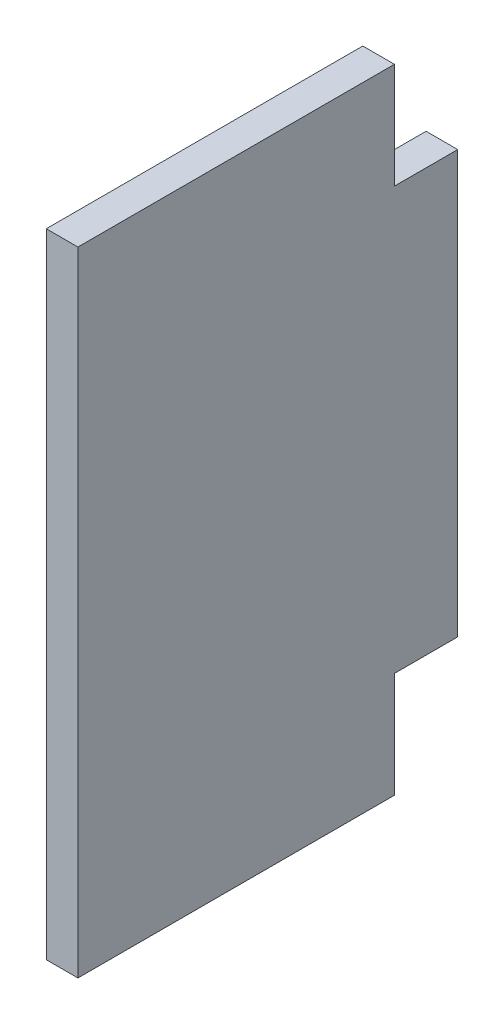
ISO-10303-21;
HEADER;
FILE_DESCRIPTION(('STEP AP214'),'2;1');
FILE_NAME('part.step','',(''),(''),'','','');
FILE_SCHEMA(('AUTOMOTIVE_DESIGN { 1 0 10303 214 1 1 1 1 }'));
ENDSEC;
DATA;
#1=APPLICATION_CONTEXT('core data for automotive mechanical design processes');
#2=APPLICATION_PROTOCOL_DEFINITION('international standard','automotive_design',2000,#1);
#3=PRODUCT_CONTEXT('',#1,'mechanical');
#4=PRODUCT('Part','Part','',(#3));
#5=PRODUCT_RELATED_PRODUCT_CATEGORY('part','',(#4));
#6=PRODUCT_DEFINITION_FORMATION('','',#4);
#7=PRODUCT_DEFINITION_CONTEXT('part definition',#1,'design');
#8=PRODUCT_DEFINITION('design','',#6,#7);
#9=PRODUCT_DEFINITION_SHAPE('','',#8);
#10=(LENGTH_UNIT() NAMED_UNIT(*) SI_UNIT(.MILLI.,.METRE.));
#11=(NAMED_UNIT(*) PLANE_ANGLE_UNIT() SI_UNIT($,.RADIAN.));
#12=(NAMED_UNIT(*) SI_UNIT($,.STERADIAN.) SOLID_ANGLE_UNIT());
#13=UNCERTAINTY_MEASURE_WITH_UNIT(LENGTH_MEASURE(1.E-05),#10,'distance_accuracy_value','');
#14=(GEOMETRIC_REPRESENTATION_CONTEXT(3) GLOBAL_UNCERTAINTY_ASSIGNED_CONTEXT((#13)) GLOBAL_UNIT_ASSIGNED_CONTEXT((#10,
#11,#12)) REPRESENTATION_CONTEXT('',''));
#15=CARTESIAN_POINT('',(0.,0.,0.));
#16=DIRECTION('',(0.,0.,1.));
#17=DIRECTION('',(1.,0.,0.));
#18=AXIS2_PLACEMENT_3D('',#15,#16,#17);
#19=CARTESIAN_POINT('',(72.5422981032107,-20.,-45.1123422402632));
#20=DIRECTION('',(0.,-1.,0.));
#21=DIRECTION('',(1.,0.,0.));
#22=AXIS2_PLACEMENT_3D('',#19,#20,#21);
#23=PLANE('',#22);
#24=DIRECTION('',(0.,0.,1.));
#25=VECTOR('',#24,1.);
#26=CARTESIAN_POINT('',(72.5422981032107,-20.,-45.1123422402632));
#27=LINE('',#26,#25);
#28=CARTESIAN_POINT('',(72.5422981032107,-20.,-5.));
#29=VERTEX_POINT('',#28);
#30=CARTESIAN_POINT('',(72.5422981032107,-20.,1.));
#31=VERTEX_POINT('',#30);
#32=EDGE_CURVE('E139',#29,#31,#27,.T.);
#33=ORIENTED_EDGE('',*,*,#32,.T.);
#34=DIRECTION('',(-1.,0.,0.));
#35=VECTOR('',#34,1.);
#36=CARTESIAN_POINT('',(69.5422981032107,-20.,1.));
#37=LINE('',#36,#35);
#38=CARTESIAN_POINT('',(69.5422981032107,-20.,0.999999999999973));
#39=VERTEX_POINT('',#38);
#40=EDGE_CURVE('E117',#31,#39,#37,.T.);
#41=ORIENTED_EDGE('',*,*,#40,.T.);
#42=DIRECTION('',(0.,0.,1.));
#43=VECTOR('',#42,1.);
#44=CARTESIAN_POINT('',(69.5422981032107,-20.,-45.1123422402632));
#45=LINE('',#44,#43);
#46=CARTESIAN_POINT('',(69.5422981032107,-20.,-5.));
#47=VERTEX_POINT('',#46);
#48=EDGE_CURVE('E106',#47,#39,#45,.T.);
#49=ORIENTED_EDGE('',*,*,#48,.F.);
#50=DIRECTION('',(-1.,0.,0.));
#51=VECTOR('',#50,1.);
#52=CARTESIAN_POINT('',(72.5422981032107,-20.,-5.));
#53=LINE('',#52,#51);
#54=EDGE_CURVE('E142',#29,#47,#53,.T.);
#55=ORIENTED_EDGE('',*,*,#54,.F.);
#56=EDGE_LOOP('',(#33,#41,#49,#55));
#57=FACE_BOUND('',#56,.T.);
#58=ADVANCED_FACE('F32',(#57),#23,.T.);
#59=CARTESIAN_POINT('',(72.5422981032107,20.,-45.1123422402632));
#60=DIRECTION('',(1.,0.,0.));
#61=DIRECTION('',(0.,0.,-1.));
#62=AXIS2_PLACEMENT_3D('',#59,#60,#61);
#63=PLANE('',#62);
#64=DIRECTION('',(0.,-1.,0.));
#65=VECTOR('',#64,1.);
#66=CARTESIAN_POINT('',(72.5422981032107,20.,-5.));
#67=LINE('',#66,#65);
#68=CARTESIAN_POINT('',(72.5422981032107,20.,-5.));
#69=VERTEX_POINT('',#68);
#70=EDGE_CURVE('E41',#69,#29,#67,.T.);
#71=ORIENTED_EDGE('',*,*,#70,.F.);
#72=DIRECTION('',(0.,0.,1.));
#73=VECTOR('',#72,1.);
#74=CARTESIAN_POINT('',(72.5422981032107,20.,-45.1123422402632));
#75=LINE('',#74,#73);
#76=CARTESIAN_POINT('',(72.5422981032107,20.,0.999999999999973));
#77=VERTEX_POINT('',#76);
#78=EDGE_CURVE('E160',#69,#77,#75,.T.);
#79=ORIENTED_EDGE('',*,*,#78,.T.);
#80=DIRECTION('',(0.,-1.,0.));
#81=VECTOR('',#80,1.);
#82=CARTESIAN_POINT('',(72.5422981032107,30.,1.));
#83=LINE('',#82,#81);
#84=CARTESIAN_POINT('',(72.5422981032107,30.,1.));
#85=VERTEX_POINT('',#84);
#86=EDGE_CURVE('E174',#85,#77,#83,.T.);
#87=ORIENTED_EDGE('',*,*,#86,.F.);
#88=DIRECTION('',(0.,0.,-1.));
#89=VECTOR('',#88,1.);
#90=CARTESIAN_POINT('',(72.5422981032107,30.,1.));
#91=LINE('',#90,#89);
#92=CARTESIAN_POINT('',(72.5422981032107,30.,31.));
#93=VERTEX_POINT('',#92);
#94=EDGE_CURVE('E189',#93,#85,#91,.T.);
#95=ORIENTED_EDGE('',*,*,#94,.F.);
#96=DIRECTION('',(0.,1.,0.));
#97=VECTOR('',#96,1.);
#98=CARTESIAN_POINT('',(72.5422981032107,20.,31.));
#99=LINE('',#98,#97);
#100=CARTESIAN_POINT('',(72.5422981032107,-30.,31.));
#101=VERTEX_POINT('',#100);
#102=EDGE_CURVE('E172',#101,#93,#99,.T.);
#103=ORIENTED_EDGE('',*,*,#102,.F.);
#104=DIRECTION('',(0.,0.,-1.));
#105=VECTOR('',#104,1.);
#106=CARTESIAN_POINT('',(72.5422981032107,-30.,1.));
#107=LINE('',#106,#105);
#108=CARTESIAN_POINT('',(72.5422981032107,-30.,1.));
#109=VERTEX_POINT('',#108);
#110=EDGE_CURVE('E120',#101,#109,#107,.T.);
#111=ORIENTED_EDGE('',*,*,#110,.T.);
#112=DIRECTION('',(0.,1.,0.));
#113=VECTOR('',#112,1.);
#114=CARTESIAN_POINT('',(72.5422981032107,-30.,1.));
#115=LINE('',#114,#113);
#116=EDGE_CURVE('E107',#109,#31,#115,.T.);
#117=ORIENTED_EDGE('',*,*,#116,.T.);
#118=ORIENTED_EDGE('',*,*,#32,.F.);
#119=EDGE_LOOP('',(#71,#79,#87,#95,#103,#111,#117,#118));
#120=FACE_BOUND('',#119,.T.);
#121=ADVANCED_FACE('F34',(#120),#63,.T.);
#122=CARTESIAN_POINT('',(69.5422981032107,20.,-45.1123422402632));
#123=DIRECTION('',(-1.,0.,0.));
#124=DIRECTION('',(0.,0.,1.));
#125=AXIS2_PLACEMENT_3D('',#122,#123,#124);
#126=PLANE('',#125);
#127=DIRECTION('',(0.,1.,0.));
#128=VECTOR('',#127,1.);
#129=CARTESIAN_POINT('',(69.5422981032107,20.,-5.));
#130=LINE('',#129,#128);
#131=CARTESIAN_POINT('',(69.5422981032107,20.,-5.00000000000001));
#132=VERTEX_POINT('',#131);
#133=EDGE_CURVE('E143',#47,#132,#130,.T.);
#134=ORIENTED_EDGE('',*,*,#133,.F.);
#135=ORIENTED_EDGE('',*,*,#48,.T.);
#136=DIRECTION('',(0.,1.,0.));
#137=VECTOR('',#136,1.);
#138=CARTESIAN_POINT('',(69.5422981032107,-30.,1.));
#139=LINE('',#138,#137);
#140=CARTESIAN_POINT('',(69.5422981032107,-30.,1.));
#141=VERTEX_POINT('',#140);
#142=EDGE_CURVE('E49',#141,#39,#139,.T.);
#143=ORIENTED_EDGE('',*,*,#142,.F.);
#144=DIRECTION('',(0.,0.,1.));
#145=VECTOR('',#144,1.);
#146=CARTESIAN_POINT('',(69.5422981032107,-30.,1.));
#147=LINE('',#146,#145);
#148=CARTESIAN_POINT('',(69.5422981032107,-30.,31.));
#149=VERTEX_POINT('',#148);
#150=EDGE_CURVE('E103',#141,#149,#147,.T.);
#151=ORIENTED_EDGE('',*,*,#150,.T.);
#152=DIRECTION('',(0.,-1.,0.));
#153=VECTOR('',#152,1.);
#154=CARTESIAN_POINT('',(69.5422981032107,20.,31.));
#155=LINE('',#154,#153);
#156=CARTESIAN_POINT('',(69.5422981032107,30.,31.));
#157=VERTEX_POINT('',#156);
#158=EDGE_CURVE('E162',#157,#149,#155,.T.);
#159=ORIENTED_EDGE('',*,*,#158,.F.);
#160=DIRECTION('',(0.,0.,1.));
#161=VECTOR('',#160,1.);
#162=CARTESIAN_POINT('',(69.5422981032107,30.,1.));
#163=LINE('',#162,#161);
#164=CARTESIAN_POINT('',(69.5422981032107,30.,1.));
#165=VERTEX_POINT('',#164);
#166=EDGE_CURVE('E127',#165,#157,#163,.T.);
#167=ORIENTED_EDGE('',*,*,#166,.F.);
#168=DIRECTION('',(0.,-1.,0.));
#169=VECTOR('',#168,1.);
#170=CARTESIAN_POINT('',(69.5422981032107,30.,1.));
#171=LINE('',#170,#169);
#172=CARTESIAN_POINT('',(69.5422981032107,20.,1.));
#173=VERTEX_POINT('',#172);
#174=EDGE_CURVE('E165',#165,#173,#171,.T.);
#175=ORIENTED_EDGE('',*,*,#174,.T.);
#176=DIRECTION('',(0.,0.,1.));
#177=VECTOR('',#176,1.);
#178=CARTESIAN_POINT('',(69.5422981032107,20.,-45.1123422402632));
#179=LINE('',#178,#177);
#180=EDGE_CURVE('E145',#132,#173,#179,.T.);
#181=ORIENTED_EDGE('',*,*,#180,.F.);
#182=EDGE_LOOP('',(#134,#135,#143,#151,#159,#167,#175,#181));
#183=FACE_BOUND('',#182,.T.);
#184=ADVANCED_FACE('F102',(#183),#126,.T.);
#185=CARTESIAN_POINT('',(72.5422981032107,20.,-45.1123422402632));
#186=DIRECTION('',(0.,1.,0.));
#187=DIRECTION('',(0.,0.,1.));
#188=AXIS2_PLACEMENT_3D('',#185,#186,#187);
#189=PLANE('',#188);
#190=DIRECTION('',(-1.,0.,0.));
#191=VECTOR('',#190,1.);
#192=CARTESIAN_POINT('',(69.5422981032107,20.,1.));
#193=LINE('',#192,#191);
#194=EDGE_CURVE('E57',#77,#173,#193,.T.);
#195=ORIENTED_EDGE('',*,*,#194,.F.);
#196=ORIENTED_EDGE('',*,*,#78,.F.);
#197=DIRECTION('',(1.,0.,0.));
#198=VECTOR('',#197,1.);
#199=CARTESIAN_POINT('',(72.5422981032107,20.,-5.));
#200=LINE('',#199,#198);
#201=EDGE_CURVE('E11',#132,#69,#200,.T.);
#202=ORIENTED_EDGE('',*,*,#201,.F.);
#203=ORIENTED_EDGE('',*,*,#180,.T.);
#204=EDGE_LOOP('',(#195,#196,#202,#203));
#205=FACE_BOUND('',#204,.T.);
#206=ADVANCED_FACE('F180',(#205),#189,.T.);
#207=CARTESIAN_POINT('',(0.,0.,-5.));
#208=DIRECTION('',(0.,0.,1.));
#209=DIRECTION('',(0.,-1.,0.));
#210=AXIS2_PLACEMENT_3D('',#207,#208,#209);
#211=PLANE('',#210);
#212=ORIENTED_EDGE('',*,*,#70,.T.);
#213=ORIENTED_EDGE('',*,*,#54,.T.);
#214=ORIENTED_EDGE('',*,*,#133,.T.);
#215=ORIENTED_EDGE('',*,*,#201,.T.);
#216=EDGE_LOOP('',(#212,#213,#214,#215));
#217=FACE_BOUND('',#216,.T.);
#218=ADVANCED_FACE('F176',(#217),#211,.F.);
#219=CARTESIAN_POINT('',(0.,0.,31.));
#220=DIRECTION('',(0.,0.,-1.));
#221=DIRECTION('',(-1.,0.,0.));
#222=AXIS2_PLACEMENT_3D('',#219,#220,#221);
#223=PLANE('',#222);
#224=ORIENTED_EDGE('',*,*,#102,.T.);
#225=DIRECTION('',(1.,0.,0.));
#226=VECTOR('',#225,1.);
#227=CARTESIAN_POINT('',(69.5422981032107,30.,31.));
#228=LINE('',#227,#226);
#229=EDGE_CURVE('E191',#157,#93,#228,.T.);
#230=ORIENTED_EDGE('',*,*,#229,.F.);
#231=ORIENTED_EDGE('',*,*,#158,.T.);
#232=DIRECTION('',(1.,0.,0.));
#233=VECTOR('',#232,1.);
#234=CARTESIAN_POINT('',(69.5422981032107,-30.,31.));
#235=LINE('',#234,#233);
#236=EDGE_CURVE('E116',#149,#101,#235,.T.);
#237=ORIENTED_EDGE('',*,*,#236,.T.);
#238=EDGE_LOOP('',(#224,#230,#231,#237));
#239=FACE_BOUND('',#238,.T.);
#240=ADVANCED_FACE('F203',(#239),#223,.F.);
#241=CARTESIAN_POINT('',(69.5422981032107,30.,1.));
#242=DIRECTION('',(0.,0.,1.));
#243=DIRECTION('',(1.,0.,0.));
#244=AXIS2_PLACEMENT_3D('',#241,#242,#243);
#245=PLANE('',#244);
#246=ORIENTED_EDGE('',*,*,#194,.T.);
#247=ORIENTED_EDGE('',*,*,#174,.F.);
#248=DIRECTION('',(-1.,0.,0.));
#249=VECTOR('',#248,1.);
#250=CARTESIAN_POINT('',(69.5422981032107,30.,1.));
#251=LINE('',#250,#249);
#252=EDGE_CURVE('E170',#85,#165,#251,.T.);
#253=ORIENTED_EDGE('',*,*,#252,.F.);
#254=ORIENTED_EDGE('',*,*,#86,.T.);
#255=EDGE_LOOP('',(#246,#247,#253,#254));
#256=FACE_BOUND('',#255,.T.);
#257=ADVANCED_FACE('F185',(#256),#245,.F.);
#258=CARTESIAN_POINT('',(0.,30.,0.));
#259=DIRECTION('',(0.,1.,0.));
#260=DIRECTION('',(0.,0.,1.));
#261=AXIS2_PLACEMENT_3D('',#258,#259,#260);
#262=PLANE('',#261);
#263=ORIENTED_EDGE('',*,*,#166,.T.);
#264=ORIENTED_EDGE('',*,*,#229,.T.);
#265=ORIENTED_EDGE('',*,*,#94,.T.);
#266=ORIENTED_EDGE('',*,*,#252,.T.);
#267=EDGE_LOOP('',(#263,#264,#265,#266));
#268=FACE_BOUND('',#267,.T.);
#269=ADVANCED_FACE('F195',(#268),#262,.T.);
#270=CARTESIAN_POINT('',(69.5422981032107,-30.,1.));
#271=DIRECTION('',(0.,0.,-1.));
#272=DIRECTION('',(-1.,0.,0.));
#273=AXIS2_PLACEMENT_3D('',#270,#271,#272);
#274=PLANE('',#273);
#275=ORIENTED_EDGE('',*,*,#40,.F.);
#276=ORIENTED_EDGE('',*,*,#116,.F.);
#277=DIRECTION('',(-1.,0.,0.));
#278=VECTOR('',#277,1.);
#279=CARTESIAN_POINT('',(69.5422981032107,-30.,1.));
#280=LINE('',#279,#278);
#281=EDGE_CURVE('E113',#109,#141,#280,.T.);
#282=ORIENTED_EDGE('',*,*,#281,.T.);
#283=ORIENTED_EDGE('',*,*,#142,.T.);
#284=EDGE_LOOP('',(#275,#276,#282,#283));
#285=FACE_BOUND('',#284,.T.);
#286=ADVANCED_FACE('F119',(#285),#274,.T.);
#287=CARTESIAN_POINT('',(0.,-30.,0.));
#288=DIRECTION('',(0.,-1.,0.));
#289=DIRECTION('',(0.,0.,1.));
#290=AXIS2_PLACEMENT_3D('',#287,#288,#289);
#291=PLANE('',#290);
#292=ORIENTED_EDGE('',*,*,#150,.F.);
#293=ORIENTED_EDGE('',*,*,#281,.F.);
#294=ORIENTED_EDGE('',*,*,#110,.F.);
#295=ORIENTED_EDGE('',*,*,#236,.F.);
#296=EDGE_LOOP('',(#292,#293,#294,#295));
#297=FACE_BOUND('',#296,.T.);
#298=ADVANCED_FACE('F111',(#297),#291,.T.);
#299=CLOSED_SHELL('',(#58,#121,#184,#206,#218,#240,#257,#269,#286,#298));
#300=MANIFOLD_SOLID_BREP('B2',#299);
#301=ADVANCED_BREP_SHAPE_REPRESENTATION('',(#18,#300),#14);
#302=SHAPE_DEFINITION_REPRESENTATION(#9,#301);
ENDSEC;
END-ISO-10303-21;
